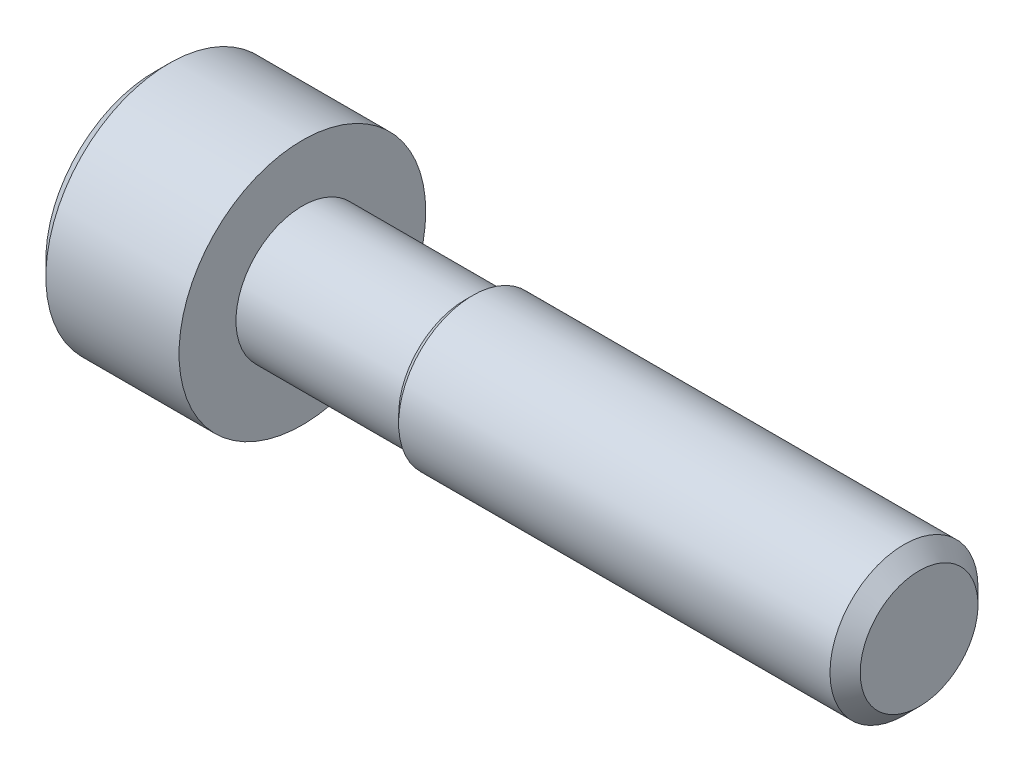
ISO-10303-21;
HEADER;
FILE_DESCRIPTION(('STEP AP214'),'2;1');
FILE_NAME('part.step','',(''),(''),'','','');
FILE_SCHEMA(('AUTOMOTIVE_DESIGN { 1 0 10303 214 1 1 1 1 }'));
ENDSEC;
DATA;
#1=APPLICATION_CONTEXT('core data for automotive mechanical design processes');
#2=APPLICATION_PROTOCOL_DEFINITION('international standard','automotive_design',2000,#1);
#3=PRODUCT_CONTEXT('',#1,'mechanical');
#4=PRODUCT('Part','Part','',(#3));
#5=PRODUCT_RELATED_PRODUCT_CATEGORY('part','',(#4));
#6=PRODUCT_DEFINITION_FORMATION('','',#4);
#7=PRODUCT_DEFINITION_CONTEXT('part definition',#1,'design');
#8=PRODUCT_DEFINITION('design','',#6,#7);
#9=PRODUCT_DEFINITION_SHAPE('','',#8);
#10=(LENGTH_UNIT() NAMED_UNIT(*) SI_UNIT(.MILLI.,.METRE.));
#11=(NAMED_UNIT(*) PLANE_ANGLE_UNIT() SI_UNIT($,.RADIAN.));
#12=(NAMED_UNIT(*) SI_UNIT($,.STERADIAN.) SOLID_ANGLE_UNIT());
#13=UNCERTAINTY_MEASURE_WITH_UNIT(LENGTH_MEASURE(1.E-05),#10,'distance_accuracy_value','');
#14=(GEOMETRIC_REPRESENTATION_CONTEXT(3) GLOBAL_UNCERTAINTY_ASSIGNED_CONTEXT((#13)) GLOBAL_UNIT_ASSIGNED_CONTEXT((#10,
#11,#12)) REPRESENTATION_CONTEXT('',''));
#15=CARTESIAN_POINT('',(0.,0.,0.));
#16=DIRECTION('',(0.,0.,1.));
#17=DIRECTION('',(1.,0.,0.));
#18=AXIS2_PLACEMENT_3D('',#15,#16,#17);
#19=CARTESIAN_POINT('',(-3.,0.,0.));
#20=DIRECTION('',(1.,0.,0.));
#21=DIRECTION('',(0.,0.,-1.));
#22=AXIS2_PLACEMENT_3D('',#19,#20,#21);
#23=PLANE('',#22);
#24=DIRECTION('',(0.,1.,0.));
#25=VECTOR('',#24,1.);
#26=CARTESIAN_POINT('',(-3.,0.,2.5));
#27=LINE('',#26,#25);
#28=CARTESIAN_POINT('',(-3.,1.44337567297406,2.5));
#29=VERTEX_POINT('',#28);
#30=CARTESIAN_POINT('',(-3.00000000002137,0.,2.49999999999886));
#31=VERTEX_POINT('',#30);
#32=EDGE_CURVE('E87',#29,#31,#27,.F.);
#33=ORIENTED_EDGE('',*,*,#32,.F.);
#34=DIRECTION('',(0.,-0.500000000000004,0.866025403784436));
#35=VECTOR('',#34,1.);
#36=CARTESIAN_POINT('',(-3.,2.1650635094611,1.25));
#37=LINE('',#36,#35);
#38=CARTESIAN_POINT('',(-3.00000000002137,2.16506350946011,1.24999999999943));
#39=VERTEX_POINT('',#38);
#40=EDGE_CURVE('E108',#39,#29,#37,.T.);
#41=ORIENTED_EDGE('',*,*,#40,.F.);
#42=CARTESIAN_POINT('',(-3.00000000004275,0.,0.));
#43=DIRECTION('',(-1.,0.,0.));
#44=DIRECTION('',(0.,0.,1.));
#45=AXIS2_PLACEMENT_3D('',#42,#43,#44);
#46=CIRCLE('',#45,2.49999999999773);
#47=EDGE_CURVE('E20',#39,#31,#46,.F.);
#48=ORIENTED_EDGE('',*,*,#47,.T.);
#49=EDGE_LOOP('',(#33,#41,#48));
#50=FACE_BOUND('',#49,.T.);
#51=ADVANCED_FACE('F17',(#50),#23,.F.);
#52=CARTESIAN_POINT('',(-3.,0.,0.));
#53=DIRECTION('',(1.,0.,0.));
#54=DIRECTION('',(0.,0.,-1.));
#55=AXIS2_PLACEMENT_3D('',#52,#53,#54);
#56=PLANE('',#55);
#57=DIRECTION('',(0.,-0.500000000000004,-0.866025403784436));
#58=VECTOR('',#57,1.);
#59=CARTESIAN_POINT('',(-3.,-1.44337567297406,2.5));
#60=LINE('',#59,#58);
#61=CARTESIAN_POINT('',(-3.,-1.44337567297406,2.5));
#62=VERTEX_POINT('',#61);
#63=CARTESIAN_POINT('',(-3.00000000002137,-2.16506350946011,1.24999999999943));
#64=VERTEX_POINT('',#63);
#65=EDGE_CURVE('E127',#62,#64,#60,.T.);
#66=ORIENTED_EDGE('',*,*,#65,.F.);
#67=DIRECTION('',(0.,1.,0.));
#68=VECTOR('',#67,1.);
#69=CARTESIAN_POINT('',(-3.,0.,2.5));
#70=LINE('',#69,#68);
#71=EDGE_CURVE('E135',#31,#62,#70,.F.);
#72=ORIENTED_EDGE('',*,*,#71,.F.);
#73=CARTESIAN_POINT('',(-3.00000000004275,0.,0.));
#74=DIRECTION('',(-1.,0.,0.));
#75=DIRECTION('',(0.,0.,1.));
#76=AXIS2_PLACEMENT_3D('',#73,#74,#75);
#77=CIRCLE('',#76,2.49999999999773);
#78=EDGE_CURVE('E118',#31,#64,#77,.F.);
#79=ORIENTED_EDGE('',*,*,#78,.T.);
#80=EDGE_LOOP('',(#66,#72,#79));
#81=FACE_BOUND('',#80,.T.);
#82=ADVANCED_FACE('F218',(#81),#56,.F.);
#83=CARTESIAN_POINT('',(-3.,0.,0.));
#84=DIRECTION('',(1.,0.,0.));
#85=DIRECTION('',(0.,0.,-1.));
#86=AXIS2_PLACEMENT_3D('',#83,#84,#85);
#87=PLANE('',#86);
#88=DIRECTION('',(0.,0.500000000000004,0.866025403784436));
#89=VECTOR('',#88,1.);
#90=CARTESIAN_POINT('',(-3.,1.44337567297406,-2.5));
#91=LINE('',#90,#89);
#92=CARTESIAN_POINT('',(-3.,1.44337567297406,-2.5));
#93=VERTEX_POINT('',#92);
#94=CARTESIAN_POINT('',(-3.00000000002137,2.16506350946011,-1.24999999999943));
#95=VERTEX_POINT('',#94);
#96=EDGE_CURVE('E119',#93,#95,#91,.T.);
#97=ORIENTED_EDGE('',*,*,#96,.F.);
#98=DIRECTION('',(0.,1.,0.));
#99=VECTOR('',#98,1.);
#100=CARTESIAN_POINT('',(-3.,0.,-2.5));
#101=LINE('',#100,#99);
#102=CARTESIAN_POINT('',(-3.00000000002137,0.,-2.49999999999886));
#103=VERTEX_POINT('',#102);
#104=EDGE_CURVE('E121',#103,#93,#101,.T.);
#105=ORIENTED_EDGE('',*,*,#104,.F.);
#106=CARTESIAN_POINT('',(-3.00000000004275,0.,0.));
#107=DIRECTION('',(-1.,0.,0.));
#108=DIRECTION('',(0.,0.,1.));
#109=AXIS2_PLACEMENT_3D('',#106,#107,#108);
#110=CIRCLE('',#109,2.49999999999773);
#111=EDGE_CURVE('E103',#103,#95,#110,.F.);
#112=ORIENTED_EDGE('',*,*,#111,.T.);
#113=EDGE_LOOP('',(#97,#105,#112));
#114=FACE_BOUND('',#113,.T.);
#115=ADVANCED_FACE('F220',(#114),#87,.F.);
#116=CARTESIAN_POINT('',(-3.00000000004275,0.,0.));
#117=DIRECTION('',(-1.,0.,0.));
#118=DIRECTION('',(0.,0.,1.));
#119=AXIS2_PLACEMENT_3D('',#116,#117,#118);
#120=CONICAL_SURFACE('',#119,2.49999999999773,1.0471975511585);
#121=CARTESIAN_POINT('',(-1.55662432709391,5.6843418860808E-11,0.));
#122=VERTEX_POINT('',#121);
#123=VERTEX_LOOP('',#122);
#124=FACE_BOUND('',#123,.T.);
#125=ORIENTED_EDGE('',*,*,#47,.F.);
#126=CARTESIAN_POINT('',(-3.00000000004275,0.,0.));
#127=DIRECTION('',(-1.,0.,0.));
#128=DIRECTION('',(0.,0.,1.));
#129=AXIS2_PLACEMENT_3D('',#126,#127,#128);
#130=CIRCLE('',#129,2.49999999999773);
#131=EDGE_CURVE('E93',#95,#39,#130,.F.);
#132=ORIENTED_EDGE('',*,*,#131,.F.);
#133=ORIENTED_EDGE('',*,*,#111,.F.);
#134=CARTESIAN_POINT('',(-3.00000000004275,0.,0.));
#135=DIRECTION('',(-1.,0.,0.));
#136=DIRECTION('',(0.,0.,1.));
#137=AXIS2_PLACEMENT_3D('',#134,#135,#136);
#138=CIRCLE('',#137,2.49999999999773);
#139=CARTESIAN_POINT('',(-3.00000000002137,-2.16506350946011,-1.24999999999943));
#140=VERTEX_POINT('',#139);
#141=EDGE_CURVE('E159',#103,#140,#138,.T.);
#142=ORIENTED_EDGE('',*,*,#141,.T.);
#143=CARTESIAN_POINT('',(-3.00000000004275,0.,0.));
#144=DIRECTION('',(-1.,0.,0.));
#145=DIRECTION('',(0.,0.,1.));
#146=AXIS2_PLACEMENT_3D('',#143,#144,#145);
#147=CIRCLE('',#146,2.49999999999773);
#148=EDGE_CURVE('E120',#64,#140,#147,.F.);
#149=ORIENTED_EDGE('',*,*,#148,.F.);
#150=ORIENTED_EDGE('',*,*,#78,.F.);
#151=EDGE_LOOP('',(#125,#132,#133,#142,#149,#150));
#152=FACE_BOUND('',#151,.T.);
#153=ADVANCED_FACE('F116',(#124,#152),#120,.F.);
#154=CARTESIAN_POINT('',(-3.,0.,0.));
#155=DIRECTION('',(1.,0.,0.));
#156=DIRECTION('',(0.,0.,-1.));
#157=AXIS2_PLACEMENT_3D('',#154,#155,#156);
#158=PLANE('',#157);
#159=DIRECTION('',(0.,1.,0.));
#160=VECTOR('',#159,1.);
#161=CARTESIAN_POINT('',(-3.,0.,-2.5));
#162=LINE('',#161,#160);
#163=CARTESIAN_POINT('',(-3.,-1.44337567297406,-2.5));
#164=VERTEX_POINT('',#163);
#165=EDGE_CURVE('E102',#164,#103,#162,.T.);
#166=ORIENTED_EDGE('',*,*,#165,.F.);
#167=DIRECTION('',(0.,0.5,-0.866025403784439));
#168=VECTOR('',#167,1.);
#169=CARTESIAN_POINT('',(-3.,-1.44337567297406,-2.5));
#170=LINE('',#169,#168);
#171=EDGE_CURVE('E174',#164,#140,#170,.F.);
#172=ORIENTED_EDGE('',*,*,#171,.T.);
#173=ORIENTED_EDGE('',*,*,#141,.F.);
#174=EDGE_LOOP('',(#166,#172,#173));
#175=FACE_BOUND('',#174,.T.);
#176=ADVANCED_FACE('F175',(#175),#158,.F.);
#177=CARTESIAN_POINT('',(-3.,0.,0.));
#178=DIRECTION('',(1.,0.,0.));
#179=DIRECTION('',(0.,0.,-1.));
#180=AXIS2_PLACEMENT_3D('',#177,#178,#179);
#181=PLANE('',#180);
#182=DIRECTION('',(0.,0.5,-0.866025403784439));
#183=VECTOR('',#182,1.);
#184=CARTESIAN_POINT('',(-3.,-1.44337567297406,-2.5));
#185=LINE('',#184,#183);
#186=CARTESIAN_POINT('',(-3.,-2.88675134594813,0.));
#187=VERTEX_POINT('',#186);
#188=EDGE_CURVE('E168',#140,#187,#185,.F.);
#189=ORIENTED_EDGE('',*,*,#188,.T.);
#190=DIRECTION('',(0.,-0.5,-0.866025403784439));
#191=VECTOR('',#190,1.);
#192=CARTESIAN_POINT('',(-3.,-2.88675134594813,0.));
#193=LINE('',#192,#191);
#194=EDGE_CURVE('E161',#187,#64,#193,.F.);
#195=ORIENTED_EDGE('',*,*,#194,.T.);
#196=ORIENTED_EDGE('',*,*,#148,.T.);
#197=EDGE_LOOP('',(#189,#195,#196));
#198=FACE_BOUND('',#197,.T.);
#199=ADVANCED_FACE('F166',(#198),#181,.F.);
#200=CARTESIAN_POINT('',(-3.,0.,0.));
#201=DIRECTION('',(1.,0.,0.));
#202=DIRECTION('',(0.,0.,-1.));
#203=AXIS2_PLACEMENT_3D('',#200,#201,#202);
#204=PLANE('',#203);
#205=DIRECTION('',(0.,-0.5,0.866025403784439));
#206=VECTOR('',#205,1.);
#207=CARTESIAN_POINT('',(-3.,1.44337567297406,2.5));
#208=LINE('',#207,#206);
#209=CARTESIAN_POINT('',(-3.,2.88675134594813,0.));
#210=VERTEX_POINT('',#209);
#211=EDGE_CURVE('E96',#39,#210,#208,.F.);
#212=ORIENTED_EDGE('',*,*,#211,.T.);
#213=DIRECTION('',(0.,0.5,0.866025403784439));
#214=VECTOR('',#213,1.);
#215=CARTESIAN_POINT('',(-3.,2.88675134594813,0.));
#216=LINE('',#215,#214);
#217=EDGE_CURVE('E98',#210,#95,#216,.F.);
#218=ORIENTED_EDGE('',*,*,#217,.T.);
#219=ORIENTED_EDGE('',*,*,#131,.T.);
#220=EDGE_LOOP('',(#212,#218,#219));
#221=FACE_BOUND('',#220,.T.);
#222=ADVANCED_FACE('F95',(#221),#204,.F.);
#223=CARTESIAN_POINT('',(-6.,-2.88675134594813,0.));
#224=DIRECTION('',(0.,-0.866025403784439,0.5));
#225=DIRECTION('',(0.,-0.5,-0.866025403784439));
#226=AXIS2_PLACEMENT_3D('',#223,#224,#225);
#227=PLANE('',#226);
#228=DIRECTION('',(1.,0.,0.));
#229=VECTOR('',#228,1.);
#230=CARTESIAN_POINT('',(-6.,-1.44337567297406,2.5));
#231=LINE('',#230,#229);
#232=CARTESIAN_POINT('',(-6.,-1.44337567297406,2.5));
#233=VERTEX_POINT('',#232);
#234=EDGE_CURVE('E139',#233,#62,#231,.T.);
#235=ORIENTED_EDGE('',*,*,#234,.T.);
#236=ORIENTED_EDGE('',*,*,#65,.T.);
#237=ORIENTED_EDGE('',*,*,#194,.F.);
#238=DIRECTION('',(1.,0.,0.));
#239=VECTOR('',#238,1.);
#240=CARTESIAN_POINT('',(-6.,-2.88675134594813,0.));
#241=LINE('',#240,#239);
#242=CARTESIAN_POINT('',(-6.,-2.88675134594813,0.));
#243=VERTEX_POINT('',#242);
#244=EDGE_CURVE('E183',#187,#243,#241,.F.);
#245=ORIENTED_EDGE('',*,*,#244,.T.);
#246=DIRECTION('',(0.,-0.500000000000001,-0.866025403784438));
#247=VECTOR('',#246,1.);
#248=CARTESIAN_POINT('',(-6.,-1.44337567297406,2.5));
#249=LINE('',#248,#247);
#250=EDGE_CURVE('E143',#233,#243,#249,.T.);
#251=ORIENTED_EDGE('',*,*,#250,.F.);
#252=EDGE_LOOP('',(#235,#236,#237,#245,#251));
#253=FACE_BOUND('',#252,.T.);
#254=ADVANCED_FACE('F214',(#253),#227,.F.);
#255=CARTESIAN_POINT('',(-6.,-1.44337567297406,-2.5));
#256=DIRECTION('',(0.,-0.866025403784439,-0.5));
#257=DIRECTION('',(0.,0.5,-0.866025403784439));
#258=AXIS2_PLACEMENT_3D('',#255,#256,#257);
#259=PLANE('',#258);
#260=ORIENTED_EDGE('',*,*,#244,.F.);
#261=ORIENTED_EDGE('',*,*,#188,.F.);
#262=ORIENTED_EDGE('',*,*,#171,.F.);
#263=DIRECTION('',(-1.,0.,0.));
#264=VECTOR('',#263,1.);
#265=CARTESIAN_POINT('',(-6.,-1.44337567297406,-2.5));
#266=LINE('',#265,#264);
#267=CARTESIAN_POINT('',(-6.,-1.44337567297406,-2.5));
#268=VERTEX_POINT('',#267);
#269=EDGE_CURVE('E130',#164,#268,#266,.T.);
#270=ORIENTED_EDGE('',*,*,#269,.T.);
#271=DIRECTION('',(0.,0.500000000000001,-0.866025403784438));
#272=VECTOR('',#271,1.);
#273=CARTESIAN_POINT('',(-6.,-2.88675134594813,0.));
#274=LINE('',#273,#272);
#275=EDGE_CURVE('E207',#243,#268,#274,.T.);
#276=ORIENTED_EDGE('',*,*,#275,.F.);
#277=EDGE_LOOP('',(#260,#261,#262,#270,#276));
#278=FACE_BOUND('',#277,.T.);
#279=ADVANCED_FACE('F181',(#278),#259,.F.);
#280=CARTESIAN_POINT('',(-6.,1.44337567297406,-2.5));
#281=DIRECTION('',(0.,0.,-1.));
#282=DIRECTION('',(-1.,0.,0.));
#283=AXIS2_PLACEMENT_3D('',#280,#281,#282);
#284=PLANE('',#283);
#285=ORIENTED_EDGE('',*,*,#269,.F.);
#286=ORIENTED_EDGE('',*,*,#165,.T.);
#287=ORIENTED_EDGE('',*,*,#104,.T.);
#288=DIRECTION('',(1.,0.,0.));
#289=VECTOR('',#288,1.);
#290=CARTESIAN_POINT('',(-6.,1.44337567297406,-2.5));
#291=LINE('',#290,#289);
#292=CARTESIAN_POINT('',(-6.,1.44337567297406,-2.5));
#293=VERTEX_POINT('',#292);
#294=EDGE_CURVE('E110',#93,#293,#291,.F.);
#295=ORIENTED_EDGE('',*,*,#294,.T.);
#296=DIRECTION('',(0.,1.,0.));
#297=VECTOR('',#296,1.);
#298=CARTESIAN_POINT('',(-6.,3.45,-2.5));
#299=LINE('',#298,#297);
#300=EDGE_CURVE('E192',#268,#293,#299,.T.);
#301=ORIENTED_EDGE('',*,*,#300,.F.);
#302=EDGE_LOOP('',(#285,#286,#287,#295,#301));
#303=FACE_BOUND('',#302,.T.);
#304=ADVANCED_FACE('F189',(#303),#284,.F.);
#305=CARTESIAN_POINT('',(-6.,2.88675134594813,0.));
#306=DIRECTION('',(0.,0.866025403784439,-0.5));
#307=DIRECTION('',(0.,0.5,0.866025403784439));
#308=AXIS2_PLACEMENT_3D('',#305,#306,#307);
#309=PLANE('',#308);
#310=ORIENTED_EDGE('',*,*,#294,.F.);
#311=ORIENTED_EDGE('',*,*,#96,.T.);
#312=ORIENTED_EDGE('',*,*,#217,.F.);
#313=DIRECTION('',(1.,0.,0.));
#314=VECTOR('',#313,1.);
#315=CARTESIAN_POINT('',(-6.,2.88675134594813,0.));
#316=LINE('',#315,#314);
#317=CARTESIAN_POINT('',(-6.,2.88675134594813,0.));
#318=VERTEX_POINT('',#317);
#319=EDGE_CURVE('E109',#210,#318,#316,.F.);
#320=ORIENTED_EDGE('',*,*,#319,.T.);
#321=DIRECTION('',(0.,0.500000000000001,0.866025403784438));
#322=VECTOR('',#321,1.);
#323=CARTESIAN_POINT('',(-6.,1.44337567297406,-2.5));
#324=LINE('',#323,#322);
#325=EDGE_CURVE('E199',#293,#318,#324,.T.);
#326=ORIENTED_EDGE('',*,*,#325,.F.);
#327=EDGE_LOOP('',(#310,#311,#312,#320,#326));
#328=FACE_BOUND('',#327,.T.);
#329=ADVANCED_FACE('F197',(#328),#309,.F.);
#330=CARTESIAN_POINT('',(-6.,1.44337567297406,2.5));
#331=DIRECTION('',(0.,0.866025403784439,0.5));
#332=DIRECTION('',(0.,-0.5,0.866025403784439));
#333=AXIS2_PLACEMENT_3D('',#330,#331,#332);
#334=PLANE('',#333);
#335=ORIENTED_EDGE('',*,*,#319,.F.);
#336=ORIENTED_EDGE('',*,*,#211,.F.);
#337=ORIENTED_EDGE('',*,*,#40,.T.);
#338=DIRECTION('',(1.,0.,0.));
#339=VECTOR('',#338,1.);
#340=CARTESIAN_POINT('',(-6.,1.44337567297406,2.5));
#341=LINE('',#340,#339);
#342=CARTESIAN_POINT('',(-6.,1.44337567297406,2.5));
#343=VERTEX_POINT('',#342);
#344=EDGE_CURVE('E35',#29,#343,#341,.F.);
#345=ORIENTED_EDGE('',*,*,#344,.T.);
#346=DIRECTION('',(0.,-0.500000000000001,0.866025403784438));
#347=VECTOR('',#346,1.);
#348=CARTESIAN_POINT('',(-6.,2.88675134594813,0.));
#349=LINE('',#348,#347);
#350=EDGE_CURVE('E201',#318,#343,#349,.T.);
#351=ORIENTED_EDGE('',*,*,#350,.F.);
#352=EDGE_LOOP('',(#335,#336,#337,#345,#351));
#353=FACE_BOUND('',#352,.T.);
#354=ADVANCED_FACE('F107',(#353),#334,.F.);
#355=CARTESIAN_POINT('',(-6.,-1.44337567297406,2.5));
#356=DIRECTION('',(0.,0.,1.));
#357=DIRECTION('',(1.,0.,0.));
#358=AXIS2_PLACEMENT_3D('',#355,#356,#357);
#359=PLANE('',#358);
#360=ORIENTED_EDGE('',*,*,#344,.F.);
#361=ORIENTED_EDGE('',*,*,#32,.T.);
#362=ORIENTED_EDGE('',*,*,#71,.T.);
#363=ORIENTED_EDGE('',*,*,#234,.F.);
#364=DIRECTION('',(0.,1.,0.));
#365=VECTOR('',#364,1.);
#366=CARTESIAN_POINT('',(-6.,3.45,2.5));
#367=LINE('',#366,#365);
#368=EDGE_CURVE('E158',#343,#233,#367,.F.);
#369=ORIENTED_EDGE('',*,*,#368,.F.);
#370=EDGE_LOOP('',(#360,#361,#362,#363,#369));
#371=FACE_BOUND('',#370,.T.);
#372=ADVANCED_FACE('F216',(#371),#359,.F.);
#373=CARTESIAN_POINT('',(-6.,3.45,0.));
#374=DIRECTION('',(-1.,0.,0.));
#375=DIRECTION('',(0.,0.,1.));
#376=AXIS2_PLACEMENT_3D('',#373,#374,#375);
#377=PLANE('',#376);
#378=CARTESIAN_POINT('',(-5.99999999997181,0.,0.));
#379=DIRECTION('',(1.,0.,0.));
#380=DIRECTION('',(0.,0.,-1.));
#381=AXIS2_PLACEMENT_3D('',#378,#379,#380);
#382=CIRCLE('',#381,4.39999999997553);
#383=CARTESIAN_POINT('',(-5.99999999997181,0.,-4.39999999997553));
#384=VERTEX_POINT('',#383);
#385=EDGE_CURVE('E155',#384,#384,#382,.T.);
#386=ORIENTED_EDGE('',*,*,#385,.F.);
#387=EDGE_LOOP('',(#386));
#388=FACE_BOUND('',#387,.T.);
#389=ORIENTED_EDGE('',*,*,#350,.T.);
#390=ORIENTED_EDGE('',*,*,#368,.T.);
#391=ORIENTED_EDGE('',*,*,#250,.T.);
#392=ORIENTED_EDGE('',*,*,#275,.T.);
#393=ORIENTED_EDGE('',*,*,#300,.T.);
#394=ORIENTED_EDGE('',*,*,#325,.T.);
#395=EDGE_LOOP('',(#389,#390,#391,#392,#393,#394));
#396=FACE_BOUND('',#395,.T.);
#397=ADVANCED_FACE('F205',(#388,#396),#377,.T.);
#398=CARTESIAN_POINT('',(-5.40000000000873,0.,0.));
#399=DIRECTION('',(1.,0.,0.));
#400=DIRECTION('',(0.,0.,-1.));
#401=AXIS2_PLACEMENT_3D('',#398,#399,#400);
#402=CONICAL_SURFACE('',#401,4.99999999993861,0.785398163397448);
#403=ORIENTED_EDGE('',*,*,#385,.T.);
#404=EDGE_LOOP('',(#403));
#405=FACE_BOUND('',#404,.T.);
#406=CARTESIAN_POINT('',(-5.4,0.,0.));
#407=DIRECTION('',(1.,0.,0.));
#408=DIRECTION('',(0.,0.,-1.));
#409=AXIS2_PLACEMENT_3D('',#406,#407,#408);
#410=CIRCLE('',#409,5.);
#411=CARTESIAN_POINT('',(-5.4,0.,-5.));
#412=VERTEX_POINT('',#411);
#413=EDGE_CURVE('E154',#412,#412,#410,.T.);
#414=ORIENTED_EDGE('',*,*,#413,.F.);
#415=EDGE_LOOP('',(#414));
#416=FACE_BOUND('',#415,.T.);
#417=ADVANCED_FACE('F260',(#405,#416),#402,.T.);
#418=CARTESIAN_POINT('',(-2.7,0.,0.));
#419=DIRECTION('',(1.,0.,0.));
#420=DIRECTION('',(0.,0.,-1.));
#421=AXIS2_PLACEMENT_3D('',#418,#419,#420);
#422=CYLINDRICAL_SURFACE('',#421,5.);
#423=ORIENTED_EDGE('',*,*,#413,.T.);
#424=EDGE_LOOP('',(#423));
#425=FACE_BOUND('',#424,.T.);
#426=CARTESIAN_POINT('',(0.,0.,0.));
#427=DIRECTION('',(1.,0.,0.));
#428=DIRECTION('',(0.,0.,-1.));
#429=AXIS2_PLACEMENT_3D('',#426,#427,#428);
#430=CIRCLE('',#429,5.);
#431=CARTESIAN_POINT('',(0.,0.,-5.));
#432=VERTEX_POINT('',#431);
#433=EDGE_CURVE('E151',#432,#432,#430,.T.);
#434=ORIENTED_EDGE('',*,*,#433,.F.);
#435=EDGE_LOOP('',(#434));
#436=FACE_BOUND('',#435,.T.);
#437=ADVANCED_FACE('F256',(#425,#436),#422,.T.);
#438=CARTESIAN_POINT('',(0.,3.84641625,0.));
#439=DIRECTION('',(1.,0.,0.));
#440=DIRECTION('',(0.,0.,-1.));
#441=AXIS2_PLACEMENT_3D('',#438,#439,#440);
#442=PLANE('',#441);
#443=CARTESIAN_POINT('',(0.,0.,0.));
#444=DIRECTION('',(1.,0.,0.));
#445=DIRECTION('',(0.,0.,-1.));
#446=AXIS2_PLACEMENT_3D('',#443,#444,#445);
#447=CIRCLE('',#446,2.6928325);
#448=CARTESIAN_POINT('',(0.,0.,-2.6928325));
#449=VERTEX_POINT('',#448);
#450=EDGE_CURVE('E148',#449,#449,#447,.T.);
#451=ORIENTED_EDGE('',*,*,#450,.F.);
#452=EDGE_LOOP('',(#451));
#453=FACE_BOUND('',#452,.T.);
#454=ORIENTED_EDGE('',*,*,#433,.T.);
#455=EDGE_LOOP('',(#454));
#456=FACE_BOUND('',#455,.T.);
#457=ADVANCED_FACE('F252',(#453,#456),#442,.T.);
#458=CARTESIAN_POINT('',(25.,1.19325,0.));
#459=DIRECTION('',(1.,0.,0.));
#460=DIRECTION('',(0.,0.,-1.));
#461=AXIS2_PLACEMENT_3D('',#458,#459,#460);
#462=PLANE('',#461);
#463=CARTESIAN_POINT('',(24.9999999999204,0.,0.));
#464=DIRECTION('',(-1.,0.,0.));
#465=DIRECTION('',(0.,0.,1.));
#466=AXIS2_PLACEMENT_3D('',#463,#464,#465);
#467=CIRCLE('',#466,2.38650000000007);
#468=CARTESIAN_POINT('',(24.9999999999204,0.,2.38650000000007));
#469=VERTEX_POINT('',#468);
#470=EDGE_CURVE('E144',#469,#469,#467,.T.);
#471=ORIENTED_EDGE('',*,*,#470,.F.);
#472=EDGE_LOOP('',(#471));
#473=FACE_BOUND('',#472,.T.);
#474=ADVANCED_FACE('F248',(#473),#462,.T.);
#475=CARTESIAN_POINT('',(3.29641625,0.,0.));
#476=DIRECTION('',(1.,0.,0.));
#477=DIRECTION('',(0.,0.,-1.));
#478=AXIS2_PLACEMENT_3D('',#475,#476,#477);
#479=CYLINDRICAL_SURFACE('',#478,2.6928325);
#480=CARTESIAN_POINT('',(6.59283250001863,0.,0.));
#481=DIRECTION('',(1.,0.,0.));
#482=DIRECTION('',(0.,1.,0.));
#483=AXIS2_PLACEMENT_3D('',#480,#481,#482);
#484=CIRCLE('',#483,2.69283250003127);
#485=CARTESIAN_POINT('',(6.59283250001863,2.69283250003127,0.));
#486=VERTEX_POINT('',#485);
#487=EDGE_CURVE('E147',#486,#486,#484,.T.);
#488=ORIENTED_EDGE('',*,*,#487,.F.);
#489=EDGE_LOOP('',(#488));
#490=FACE_BOUND('',#489,.T.);
#491=ORIENTED_EDGE('',*,*,#450,.T.);
#492=EDGE_LOOP('',(#491));
#493=FACE_BOUND('',#492,.T.);
#494=ADVANCED_FACE('F244',(#490,#493),#479,.T.);
#495=CARTESIAN_POINT('',(24.3864999999914,0.,0.));
#496=DIRECTION('',(-1.,0.,0.));
#497=DIRECTION('',(0.,0.,1.));
#498=AXIS2_PLACEMENT_3D('',#495,#496,#497);
#499=CONICAL_SURFACE('',#498,2.9999999999859,0.785398163443775);
#500=ORIENTED_EDGE('',*,*,#470,.T.);
#501=EDGE_LOOP('',(#500));
#502=FACE_BOUND('',#501,.T.);
#503=CARTESIAN_POINT('',(24.3865,0.,0.));
#504=DIRECTION('',(1.,0.,0.));
#505=DIRECTION('',(0.,0.,-1.));
#506=AXIS2_PLACEMENT_3D('',#503,#504,#505);
#507=CIRCLE('',#506,3.);
#508=CARTESIAN_POINT('',(24.3865,0.,-3.));
#509=VERTEX_POINT('',#508);
#510=EDGE_CURVE('E26',#509,#509,#507,.F.);
#511=ORIENTED_EDGE('',*,*,#510,.F.);
#512=EDGE_LOOP('',(#511));
#513=FACE_BOUND('',#512,.T.);
#514=ADVANCED_FACE('F236',(#502,#513),#499,.T.);
#515=CARTESIAN_POINT('',(6.9000000000301,0.,0.));
#516=DIRECTION('',(1.,0.,0.));
#517=DIRECTION('',(0.,0.,-1.));
#518=AXIS2_PLACEMENT_3D('',#515,#516,#517);
#519=CONICAL_SURFACE('',#518,3.00000000004275,0.785398163397448);
#520=ORIENTED_EDGE('',*,*,#487,.T.);
#521=EDGE_LOOP('',(#520));
#522=FACE_BOUND('',#521,.T.);
#523=CARTESIAN_POINT('',(6.9,0.,0.));
#524=DIRECTION('',(1.,0.,0.));
#525=DIRECTION('',(0.,0.,-1.));
#526=AXIS2_PLACEMENT_3D('',#523,#524,#525);
#527=CIRCLE('',#526,3.);
#528=CARTESIAN_POINT('',(6.9,0.,-3.));
#529=VERTEX_POINT('',#528);
#530=EDGE_CURVE('E11',#529,#529,#527,.T.);
#531=ORIENTED_EDGE('',*,*,#530,.F.);
#532=EDGE_LOOP('',(#531));
#533=FACE_BOUND('',#532,.T.);
#534=ADVANCED_FACE('F230',(#522,#533),#519,.T.);
#535=CARTESIAN_POINT('',(15.64325,0.,0.));
#536=DIRECTION('',(1.,0.,0.));
#537=DIRECTION('',(0.,0.,-1.));
#538=AXIS2_PLACEMENT_3D('',#535,#536,#537);
#539=CYLINDRICAL_SURFACE('',#538,3.);
#540=ORIENTED_EDGE('',*,*,#510,.T.);
#541=EDGE_LOOP('',(#540));
#542=FACE_BOUND('',#541,.T.);
#543=ORIENTED_EDGE('',*,*,#530,.T.);
#544=EDGE_LOOP('',(#543));
#545=FACE_BOUND('',#544,.T.);
#546=ADVANCED_FACE('F228',(#542,#545),#539,.T.);
#547=CLOSED_SHELL('',(#51,#82,#115,#153,#176,#199,#222,#254,#279,#304,#329,#354,#372,#397,#417,
#437,#457,#474,#494,#514,#534,#546));
#548=MANIFOLD_SOLID_BREP('B1',#547);
#549=ADVANCED_BREP_SHAPE_REPRESENTATION('',(#18,#548),#14);
#550=SHAPE_DEFINITION_REPRESENTATION(#9,#549);
ENDSEC;
END-ISO-10303-21;
